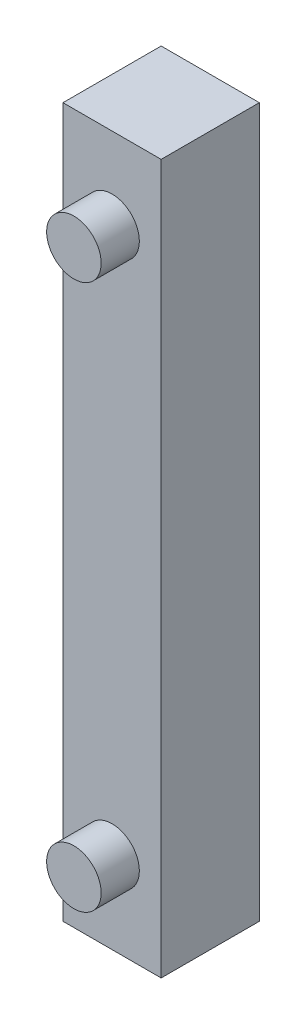
ISO-10303-21;
HEADER;
FILE_DESCRIPTION(('STEP AP214'),'2;1');
FILE_NAME('part.step','',(''),(''),'','','');
FILE_SCHEMA(('AUTOMOTIVE_DESIGN { 1 0 10303 214 1 1 1 1 }'));
ENDSEC;
DATA;
#1=APPLICATION_CONTEXT('core data for automotive mechanical design processes');
#2=APPLICATION_PROTOCOL_DEFINITION('international standard','automotive_design',2000,#1);
#3=PRODUCT_CONTEXT('',#1,'mechanical');
#4=PRODUCT('Part','Part','',(#3));
#5=PRODUCT_RELATED_PRODUCT_CATEGORY('part','',(#4));
#6=PRODUCT_DEFINITION_FORMATION('','',#4);
#7=PRODUCT_DEFINITION_CONTEXT('part definition',#1,'design');
#8=PRODUCT_DEFINITION('design','',#6,#7);
#9=PRODUCT_DEFINITION_SHAPE('','',#8);
#10=(LENGTH_UNIT() NAMED_UNIT(*) SI_UNIT(.MILLI.,.METRE.));
#11=(NAMED_UNIT(*) PLANE_ANGLE_UNIT() SI_UNIT($,.RADIAN.));
#12=(NAMED_UNIT(*) SI_UNIT($,.STERADIAN.) SOLID_ANGLE_UNIT());
#13=UNCERTAINTY_MEASURE_WITH_UNIT(LENGTH_MEASURE(1.E-05),#10,'distance_accuracy_value','');
#14=(GEOMETRIC_REPRESENTATION_CONTEXT(3) GLOBAL_UNCERTAINTY_ASSIGNED_CONTEXT((#13)) GLOBAL_UNIT_ASSIGNED_CONTEXT((#10,
#11,#12)) REPRESENTATION_CONTEXT('',''));
#15=CARTESIAN_POINT('',(0.,0.,0.));
#16=DIRECTION('',(0.,0.,1.));
#17=DIRECTION('',(1.,0.,0.));
#18=AXIS2_PLACEMENT_3D('',#15,#16,#17);
#19=CARTESIAN_POINT('',(4.5,32.5,6.25));
#20=DIRECTION('',(0.,-1.,0.));
#21=DIRECTION('',(0.,0.,-1.));
#22=AXIS2_PLACEMENT_3D('',#19,#20,#21);
#23=PLANE('',#22);
#24=DIRECTION('',(-1.,0.,0.));
#25=VECTOR('',#24,1.);
#26=CARTESIAN_POINT('',(0.,32.5,2.75));
#27=LINE('',#26,#25);
#28=CARTESIAN_POINT('',(4.5,32.5,2.75));
#29=VERTEX_POINT('',#28);
#30=CARTESIAN_POINT('',(-4.5,32.5,2.75));
#31=VERTEX_POINT('',#30);
#32=EDGE_CURVE('E79',#29,#31,#27,.T.);
#33=ORIENTED_EDGE('',*,*,#32,.F.);
#34=DIRECTION('',(0.,0.,-1.));
#35=VECTOR('',#34,1.);
#36=CARTESIAN_POINT('',(4.5,32.5,6.25));
#37=LINE('',#36,#35);
#38=CARTESIAN_POINT('',(4.5,32.5,-6.25));
#39=VERTEX_POINT('',#38);
#40=EDGE_CURVE('E61',#29,#39,#37,.T.);
#41=ORIENTED_EDGE('',*,*,#40,.T.);
#42=DIRECTION('',(-1.,0.,0.));
#43=VECTOR('',#42,1.);
#44=CARTESIAN_POINT('',(4.5,32.5,-6.25));
#45=LINE('',#44,#43);
#46=CARTESIAN_POINT('',(-4.5,32.5,-6.25));
#47=VERTEX_POINT('',#46);
#48=EDGE_CURVE('E109',#39,#47,#45,.T.);
#49=ORIENTED_EDGE('',*,*,#48,.T.);
#50=DIRECTION('',(0.,0.,-1.));
#51=VECTOR('',#50,1.);
#52=CARTESIAN_POINT('',(-4.5,32.5,6.25));
#53=LINE('',#52,#51);
#54=EDGE_CURVE('E11',#31,#47,#53,.T.);
#55=ORIENTED_EDGE('',*,*,#54,.F.);
#56=EDGE_LOOP('',(#33,#41,#49,#55));
#57=FACE_BOUND('',#56,.T.);
#58=ADVANCED_FACE('F39',(#57),#23,.F.);
#59=CARTESIAN_POINT('',(-4.5,-32.5,6.25));
#60=DIRECTION('',(1.,0.,0.));
#61=DIRECTION('',(0.,0.,-1.));
#62=AXIS2_PLACEMENT_3D('',#59,#60,#61);
#63=PLANE('',#62);
#64=DIRECTION('',(0.,-1.,0.));
#65=VECTOR('',#64,1.);
#66=CARTESIAN_POINT('',(-4.5,0.,2.75));
#67=LINE('',#66,#65);
#68=CARTESIAN_POINT('',(-4.5,-32.5,2.75));
#69=VERTEX_POINT('',#68);
#70=EDGE_CURVE('E86',#31,#69,#67,.T.);
#71=ORIENTED_EDGE('',*,*,#70,.F.);
#72=ORIENTED_EDGE('',*,*,#54,.T.);
#73=DIRECTION('',(0.,-1.,0.));
#74=VECTOR('',#73,1.);
#75=CARTESIAN_POINT('',(-4.5,-32.5,-6.25));
#76=LINE('',#75,#74);
#77=CARTESIAN_POINT('',(-4.5,-32.5,-6.25));
#78=VERTEX_POINT('',#77);
#79=EDGE_CURVE('E106',#47,#78,#76,.T.);
#80=ORIENTED_EDGE('',*,*,#79,.T.);
#81=DIRECTION('',(0.,0.,-1.));
#82=VECTOR('',#81,1.);
#83=CARTESIAN_POINT('',(-4.5,-32.5,6.25));
#84=LINE('',#83,#82);
#85=EDGE_CURVE('E46',#69,#78,#84,.T.);
#86=ORIENTED_EDGE('',*,*,#85,.F.);
#87=EDGE_LOOP('',(#71,#72,#80,#86));
#88=FACE_BOUND('',#87,.T.);
#89=ADVANCED_FACE('F107',(#88),#63,.F.);
#90=CARTESIAN_POINT('',(4.5,-32.5,6.25));
#91=DIRECTION('',(0.,1.,0.));
#92=DIRECTION('',(0.,0.,1.));
#93=AXIS2_PLACEMENT_3D('',#90,#91,#92);
#94=PLANE('',#93);
#95=DIRECTION('',(1.,0.,0.));
#96=VECTOR('',#95,1.);
#97=CARTESIAN_POINT('',(0.,-32.5,2.75));
#98=LINE('',#97,#96);
#99=CARTESIAN_POINT('',(4.5,-32.5,2.75));
#100=VERTEX_POINT('',#99);
#101=EDGE_CURVE('E53',#69,#100,#98,.T.);
#102=ORIENTED_EDGE('',*,*,#101,.F.);
#103=ORIENTED_EDGE('',*,*,#85,.T.);
#104=DIRECTION('',(1.,0.,0.));
#105=VECTOR('',#104,1.);
#106=CARTESIAN_POINT('',(4.5,-32.5,-6.25));
#107=LINE('',#106,#105);
#108=CARTESIAN_POINT('',(4.5,-32.5,-6.25));
#109=VERTEX_POINT('',#108);
#110=EDGE_CURVE('E95',#78,#109,#107,.T.);
#111=ORIENTED_EDGE('',*,*,#110,.T.);
#112=DIRECTION('',(0.,0.,-1.));
#113=VECTOR('',#112,1.);
#114=CARTESIAN_POINT('',(4.5,-32.5,6.25));
#115=LINE('',#114,#113);
#116=EDGE_CURVE('E92',#100,#109,#115,.T.);
#117=ORIENTED_EDGE('',*,*,#116,.F.);
#118=EDGE_LOOP('',(#102,#103,#111,#117));
#119=FACE_BOUND('',#118,.T.);
#120=ADVANCED_FACE('F102',(#119),#94,.F.);
#121=CARTESIAN_POINT('',(4.5,-32.5,6.25));
#122=DIRECTION('',(-1.,0.,0.));
#123=DIRECTION('',(0.,0.,1.));
#124=AXIS2_PLACEMENT_3D('',#121,#122,#123);
#125=PLANE('',#124);
#126=DIRECTION('',(0.,1.,0.));
#127=VECTOR('',#126,1.);
#128=CARTESIAN_POINT('',(4.5,0.,2.75));
#129=LINE('',#128,#127);
#130=EDGE_CURVE('E77',#100,#29,#129,.T.);
#131=ORIENTED_EDGE('',*,*,#130,.F.);
#132=ORIENTED_EDGE('',*,*,#116,.T.);
#133=DIRECTION('',(0.,1.,0.));
#134=VECTOR('',#133,1.);
#135=CARTESIAN_POINT('',(4.5,-32.5,-6.25));
#136=LINE('',#135,#134);
#137=EDGE_CURVE('E90',#109,#39,#136,.T.);
#138=ORIENTED_EDGE('',*,*,#137,.T.);
#139=ORIENTED_EDGE('',*,*,#40,.F.);
#140=EDGE_LOOP('',(#131,#132,#138,#139));
#141=FACE_BOUND('',#140,.T.);
#142=ADVANCED_FACE('F88',(#141),#125,.F.);
#143=CARTESIAN_POINT('',(0.,0.,-6.25));
#144=DIRECTION('',(0.,0.,-1.));
#145=DIRECTION('',(-1.,0.,0.));
#146=AXIS2_PLACEMENT_3D('',#143,#144,#145);
#147=PLANE('',#146);
#148=ORIENTED_EDGE('',*,*,#48,.F.);
#149=ORIENTED_EDGE('',*,*,#137,.F.);
#150=ORIENTED_EDGE('',*,*,#110,.F.);
#151=ORIENTED_EDGE('',*,*,#79,.F.);
#152=EDGE_LOOP('',(#148,#149,#150,#151));
#153=FACE_BOUND('',#152,.T.);
#154=ADVANCED_FACE('F111',(#153),#147,.T.);
#155=CARTESIAN_POINT('',(0.,25.,2.75));
#156=DIRECTION('',(0.,0.,1.));
#157=DIRECTION('',(1.,0.,0.));
#158=AXIS2_PLACEMENT_3D('',#155,#156,#157);
#159=CYLINDRICAL_SURFACE('',#158,2.5);
#160=CARTESIAN_POINT('',(0.,25.,2.75));
#161=DIRECTION('',(0.,0.,1.));
#162=DIRECTION('',(1.,0.,0.));
#163=AXIS2_PLACEMENT_3D('',#160,#161,#162);
#164=CIRCLE('',#163,2.5);
#165=CARTESIAN_POINT('',(2.5,25.,2.75));
#166=VERTEX_POINT('',#165);
#167=EDGE_CURVE('E83',#166,#166,#164,.T.);
#168=ORIENTED_EDGE('',*,*,#167,.T.);
#169=EDGE_LOOP('',(#168));
#170=FACE_BOUND('',#169,.T.);
#171=CARTESIAN_POINT('',(0.,25.,6.25));
#172=DIRECTION('',(0.,0.,1.));
#173=DIRECTION('',(1.,0.,0.));
#174=AXIS2_PLACEMENT_3D('',#171,#172,#173);
#175=CIRCLE('',#174,2.5);
#176=CARTESIAN_POINT('',(2.5,25.,6.25));
#177=VERTEX_POINT('',#176);
#178=EDGE_CURVE('E114',#177,#177,#175,.T.);
#179=ORIENTED_EDGE('',*,*,#178,.F.);
#180=EDGE_LOOP('',(#179));
#181=FACE_BOUND('',#180,.T.);
#182=ADVANCED_FACE('F137',(#170,#181),#159,.T.);
#183=CARTESIAN_POINT('',(0.,-25.,2.75));
#184=DIRECTION('',(0.,0.,1.));
#185=DIRECTION('',(1.,0.,0.));
#186=AXIS2_PLACEMENT_3D('',#183,#184,#185);
#187=CYLINDRICAL_SURFACE('',#186,2.5);
#188=CARTESIAN_POINT('',(0.,-25.,2.75));
#189=DIRECTION('',(0.,0.,1.));
#190=DIRECTION('',(1.,0.,0.));
#191=AXIS2_PLACEMENT_3D('',#188,#189,#190);
#192=CIRCLE('',#191,2.5);
#193=CARTESIAN_POINT('',(2.5,-25.,2.75));
#194=VERTEX_POINT('',#193);
#195=EDGE_CURVE('E117',#194,#194,#192,.T.);
#196=ORIENTED_EDGE('',*,*,#195,.T.);
#197=EDGE_LOOP('',(#196));
#198=FACE_BOUND('',#197,.T.);
#199=CARTESIAN_POINT('',(0.,-25.,6.25));
#200=DIRECTION('',(0.,0.,1.));
#201=DIRECTION('',(1.,0.,0.));
#202=AXIS2_PLACEMENT_3D('',#199,#200,#201);
#203=CIRCLE('',#202,2.5);
#204=CARTESIAN_POINT('',(2.5,-25.,6.25));
#205=VERTEX_POINT('',#204);
#206=EDGE_CURVE('E118',#205,#205,#203,.T.);
#207=ORIENTED_EDGE('',*,*,#206,.F.);
#208=EDGE_LOOP('',(#207));
#209=FACE_BOUND('',#208,.T.);
#210=ADVANCED_FACE('F128',(#198,#209),#187,.T.);
#211=CARTESIAN_POINT('',(0.,0.,2.75));
#212=DIRECTION('',(0.,0.,1.));
#213=DIRECTION('',(1.,0.,0.));
#214=AXIS2_PLACEMENT_3D('',#211,#212,#213);
#215=PLANE('',#214);
#216=ORIENTED_EDGE('',*,*,#195,.F.);
#217=EDGE_LOOP('',(#216));
#218=FACE_BOUND('',#217,.T.);
#219=ORIENTED_EDGE('',*,*,#167,.F.);
#220=EDGE_LOOP('',(#219));
#221=FACE_BOUND('',#220,.T.);
#222=ORIENTED_EDGE('',*,*,#130,.T.);
#223=ORIENTED_EDGE('',*,*,#32,.T.);
#224=ORIENTED_EDGE('',*,*,#70,.T.);
#225=ORIENTED_EDGE('',*,*,#101,.T.);
#226=EDGE_LOOP('',(#222,#223,#224,#225));
#227=FACE_BOUND('',#226,.T.);
#228=ADVANCED_FACE('F78',(#218,#221,#227),#215,.T.);
#229=CARTESIAN_POINT('',(0.,0.,6.25));
#230=DIRECTION('',(0.,0.,-1.));
#231=DIRECTION('',(-1.,0.,0.));
#232=AXIS2_PLACEMENT_3D('',#229,#230,#231);
#233=PLANE('',#232);
#234=ORIENTED_EDGE('',*,*,#178,.T.);
#235=EDGE_LOOP('',(#234));
#236=FACE_BOUND('',#235,.T.);
#237=ADVANCED_FACE('F133',(#236),#233,.F.);
#238=ORIENTED_EDGE('',*,*,#206,.T.);
#239=EDGE_LOOP('',(#238));
#240=FACE_BOUND('',#239,.T.);
#241=ADVANCED_FACE('F144',(#240),#233,.F.);
#242=CLOSED_SHELL('',(#58,#89,#120,#142,#154,#182,#210,#228,#237,#241));
#243=MANIFOLD_SOLID_BREP('B2',#242);
#244=ADVANCED_BREP_SHAPE_REPRESENTATION('',(#18,#243),#14);
#245=SHAPE_DEFINITION_REPRESENTATION(#9,#244);
ENDSEC;
END-ISO-10303-21;
